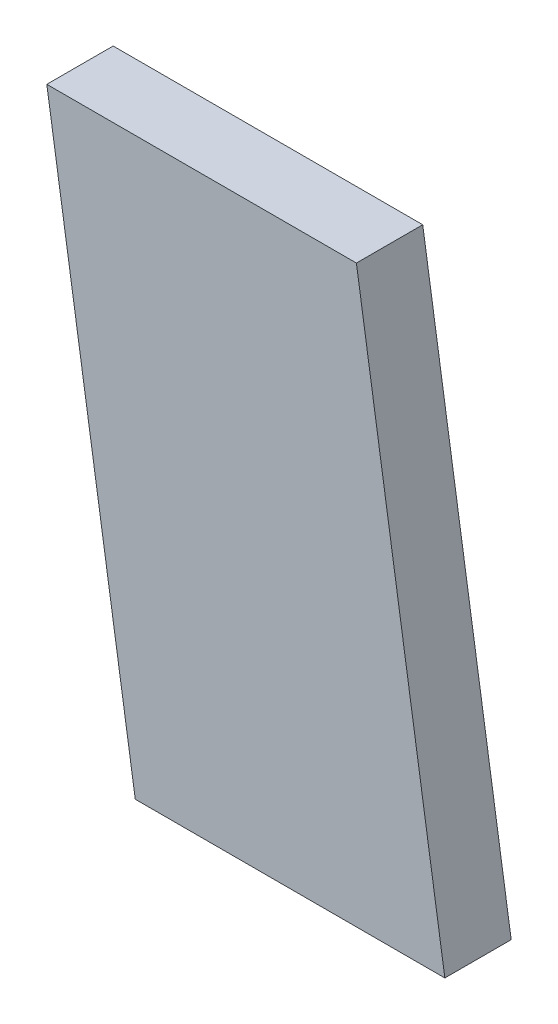
ISO-10303-21;
HEADER;
FILE_DESCRIPTION(('STEP AP214'),'2;1');
FILE_NAME('part.step','',(''),(''),'','','');
FILE_SCHEMA(('AUTOMOTIVE_DESIGN { 1 0 10303 214 1 1 1 1 }'));
ENDSEC;
DATA;
#1=APPLICATION_CONTEXT('core data for automotive mechanical design processes');
#2=APPLICATION_PROTOCOL_DEFINITION('international standard','automotive_design',2000,#1);
#3=PRODUCT_CONTEXT('',#1,'mechanical');
#4=PRODUCT('Part','Part','',(#3));
#5=PRODUCT_RELATED_PRODUCT_CATEGORY('part','',(#4));
#6=PRODUCT_DEFINITION_FORMATION('','',#4);
#7=PRODUCT_DEFINITION_CONTEXT('part definition',#1,'design');
#8=PRODUCT_DEFINITION('design','',#6,#7);
#9=PRODUCT_DEFINITION_SHAPE('','',#8);
#10=(LENGTH_UNIT() NAMED_UNIT(*) SI_UNIT(.MILLI.,.METRE.));
#11=(NAMED_UNIT(*) PLANE_ANGLE_UNIT() SI_UNIT($,.RADIAN.));
#12=(NAMED_UNIT(*) SI_UNIT($,.STERADIAN.) SOLID_ANGLE_UNIT());
#13=UNCERTAINTY_MEASURE_WITH_UNIT(LENGTH_MEASURE(1.E-05),#10,'distance_accuracy_value','');
#14=(GEOMETRIC_REPRESENTATION_CONTEXT(3) GLOBAL_UNCERTAINTY_ASSIGNED_CONTEXT((#13)) GLOBAL_UNIT_ASSIGNED_CONTEXT((#10,
#11,#12)) REPRESENTATION_CONTEXT('',''));
#15=CARTESIAN_POINT('',(0.,0.,0.));
#16=DIRECTION('',(0.,0.,1.));
#17=DIRECTION('',(1.,0.,0.));
#18=AXIS2_PLACEMENT_3D('',#15,#16,#17);
#19=CARTESIAN_POINT('',(2070.,450.,15.));
#20=DIRECTION('',(0.,1.,0.));
#21=DIRECTION('',(0.,0.,1.));
#22=AXIS2_PLACEMENT_3D('',#19,#20,#21);
#23=PLANE('',#22);
#24=DIRECTION('',(1.,0.,0.));
#25=VECTOR('',#24,1.);
#26=CARTESIAN_POINT('',(2070.,450.,0.));
#27=LINE('',#26,#25);
#28=CARTESIAN_POINT('',(2000.,450.,0.));
#29=VERTEX_POINT('',#28);
#30=CARTESIAN_POINT('',(2070.,450.,0.));
#31=VERTEX_POINT('',#30);
#32=EDGE_CURVE('E105',#29,#31,#27,.T.);
#33=ORIENTED_EDGE('',*,*,#32,.T.);
#34=DIRECTION('',(0.,0.,-1.));
#35=VECTOR('',#34,1.);
#36=CARTESIAN_POINT('',(2070.,450.,15.));
#37=LINE('',#36,#35);
#38=CARTESIAN_POINT('',(2070.,450.,15.));
#39=VERTEX_POINT('',#38);
#40=EDGE_CURVE('E11',#39,#31,#37,.T.);
#41=ORIENTED_EDGE('',*,*,#40,.F.);
#42=DIRECTION('',(1.,0.,0.));
#43=VECTOR('',#42,1.);
#44=CARTESIAN_POINT('',(2070.,450.,15.));
#45=LINE('',#44,#43);
#46=CARTESIAN_POINT('',(2000.,450.,15.));
#47=VERTEX_POINT('',#46);
#48=EDGE_CURVE('E89',#47,#39,#45,.T.);
#49=ORIENTED_EDGE('',*,*,#48,.F.);
#50=DIRECTION('',(0.,0.,-1.));
#51=VECTOR('',#50,1.);
#52=CARTESIAN_POINT('',(2000.,450.,15.));
#53=LINE('',#52,#51);
#54=EDGE_CURVE('E97',#47,#29,#53,.T.);
#55=ORIENTED_EDGE('',*,*,#54,.T.);
#56=EDGE_LOOP('',(#33,#41,#49,#55));
#57=FACE_BOUND('',#56,.T.);
#58=ADVANCED_FACE('F39',(#57),#23,.F.);
#59=CARTESIAN_POINT('',(2050.,580.,15.));
#60=DIRECTION('',(-0.988371697650617,-0.152057184253941,0.));
#61=DIRECTION('',(0.152057184253941,-0.988371697650617,0.));
#62=AXIS2_PLACEMENT_3D('',#59,#60,#61);
#63=PLANE('',#62);
#64=DIRECTION('',(-0.152057184253941,0.988371697650617,0.));
#65=VECTOR('',#64,1.);
#66=CARTESIAN_POINT('',(2050.,580.,0.));
#67=LINE('',#66,#65);
#68=CARTESIAN_POINT('',(2050.,580.,0.));
#69=VERTEX_POINT('',#68);
#70=EDGE_CURVE('E92',#31,#69,#67,.T.);
#71=ORIENTED_EDGE('',*,*,#70,.T.);
#72=DIRECTION('',(0.,0.,-1.));
#73=VECTOR('',#72,1.);
#74=CARTESIAN_POINT('',(2050.,580.,15.));
#75=LINE('',#74,#73);
#76=CARTESIAN_POINT('',(2050.,580.,15.));
#77=VERTEX_POINT('',#76);
#78=EDGE_CURVE('E50',#77,#69,#75,.T.);
#79=ORIENTED_EDGE('',*,*,#78,.F.);
#80=DIRECTION('',(-0.152057184253941,0.988371697650617,0.));
#81=VECTOR('',#80,1.);
#82=CARTESIAN_POINT('',(2050.,580.,15.));
#83=LINE('',#82,#81);
#84=EDGE_CURVE('E82',#39,#77,#83,.T.);
#85=ORIENTED_EDGE('',*,*,#84,.F.);
#86=ORIENTED_EDGE('',*,*,#40,.T.);
#87=EDGE_LOOP('',(#71,#79,#85,#86));
#88=FACE_BOUND('',#87,.T.);
#89=ADVANCED_FACE('F93',(#88),#63,.F.);
#90=CARTESIAN_POINT('',(1980.,580.,15.));
#91=DIRECTION('',(0.,-1.,0.));
#92=DIRECTION('',(0.,0.,-1.));
#93=AXIS2_PLACEMENT_3D('',#90,#91,#92);
#94=PLANE('',#93);
#95=DIRECTION('',(-1.,0.,0.));
#96=VECTOR('',#95,1.);
#97=CARTESIAN_POINT('',(1980.,580.,0.));
#98=LINE('',#97,#96);
#99=CARTESIAN_POINT('',(1980.,580.,0.));
#100=VERTEX_POINT('',#99);
#101=EDGE_CURVE('E72',#69,#100,#98,.T.);
#102=ORIENTED_EDGE('',*,*,#101,.T.);
#103=DIRECTION('',(0.,0.,-1.));
#104=VECTOR('',#103,1.);
#105=CARTESIAN_POINT('',(1980.,580.,15.));
#106=LINE('',#105,#104);
#107=CARTESIAN_POINT('',(1980.,580.,15.));
#108=VERTEX_POINT('',#107);
#109=EDGE_CURVE('E94',#108,#100,#106,.T.);
#110=ORIENTED_EDGE('',*,*,#109,.F.);
#111=DIRECTION('',(-1.,0.,0.));
#112=VECTOR('',#111,1.);
#113=CARTESIAN_POINT('',(1980.,580.,15.));
#114=LINE('',#113,#112);
#115=EDGE_CURVE('E88',#77,#108,#114,.T.);
#116=ORIENTED_EDGE('',*,*,#115,.F.);
#117=ORIENTED_EDGE('',*,*,#78,.T.);
#118=EDGE_LOOP('',(#102,#110,#116,#117));
#119=FACE_BOUND('',#118,.T.);
#120=ADVANCED_FACE('F96',(#119),#94,.F.);
#121=CARTESIAN_POINT('',(2000.,450.,15.));
#122=DIRECTION('',(0.988371697650617,0.152057184253941,0.));
#123=DIRECTION('',(-0.152057184253941,0.988371697650617,0.));
#124=AXIS2_PLACEMENT_3D('',#121,#122,#123);
#125=PLANE('',#124);
#126=DIRECTION('',(0.152057184253941,-0.988371697650617,0.));
#127=VECTOR('',#126,1.);
#128=CARTESIAN_POINT('',(2000.,450.,0.));
#129=LINE('',#128,#127);
#130=EDGE_CURVE('E76',#100,#29,#129,.T.);
#131=ORIENTED_EDGE('',*,*,#130,.T.);
#132=ORIENTED_EDGE('',*,*,#54,.F.);
#133=DIRECTION('',(0.152057184253941,-0.988371697650617,0.));
#134=VECTOR('',#133,1.);
#135=CARTESIAN_POINT('',(2000.,450.,15.));
#136=LINE('',#135,#134);
#137=EDGE_CURVE('E54',#108,#47,#136,.T.);
#138=ORIENTED_EDGE('',*,*,#137,.F.);
#139=ORIENTED_EDGE('',*,*,#109,.T.);
#140=EDGE_LOOP('',(#131,#132,#138,#139));
#141=FACE_BOUND('',#140,.T.);
#142=ADVANCED_FACE('F108',(#141),#125,.F.);
#143=CARTESIAN_POINT('',(0.,0.,15.));
#144=DIRECTION('',(0.,0.,-1.));
#145=DIRECTION('',(-1.,0.,0.));
#146=AXIS2_PLACEMENT_3D('',#143,#144,#145);
#147=PLANE('',#146);
#148=ORIENTED_EDGE('',*,*,#48,.T.);
#149=ORIENTED_EDGE('',*,*,#84,.T.);
#150=ORIENTED_EDGE('',*,*,#115,.T.);
#151=ORIENTED_EDGE('',*,*,#137,.T.);
#152=EDGE_LOOP('',(#148,#149,#150,#151));
#153=FACE_BOUND('',#152,.T.);
#154=ADVANCED_FACE('F86',(#153),#147,.F.);
#155=CARTESIAN_POINT('',(0.,0.,0.));
#156=DIRECTION('',(0.,0.,-1.));
#157=DIRECTION('',(-1.,0.,0.));
#158=AXIS2_PLACEMENT_3D('',#155,#156,#157);
#159=PLANE('',#158);
#160=ORIENTED_EDGE('',*,*,#32,.F.);
#161=ORIENTED_EDGE('',*,*,#130,.F.);
#162=ORIENTED_EDGE('',*,*,#101,.F.);
#163=ORIENTED_EDGE('',*,*,#70,.F.);
#164=EDGE_LOOP('',(#160,#161,#162,#163));
#165=FACE_BOUND('',#164,.T.);
#166=ADVANCED_FACE('F115',(#165),#159,.T.);
#167=CLOSED_SHELL('',(#58,#89,#120,#142,#154,#166));
#168=MANIFOLD_SOLID_BREP('B2',#167);
#169=ADVANCED_BREP_SHAPE_REPRESENTATION('',(#18,#168),#14);
#170=SHAPE_DEFINITION_REPRESENTATION(#9,#169);
ENDSEC;
END-ISO-10303-21;
